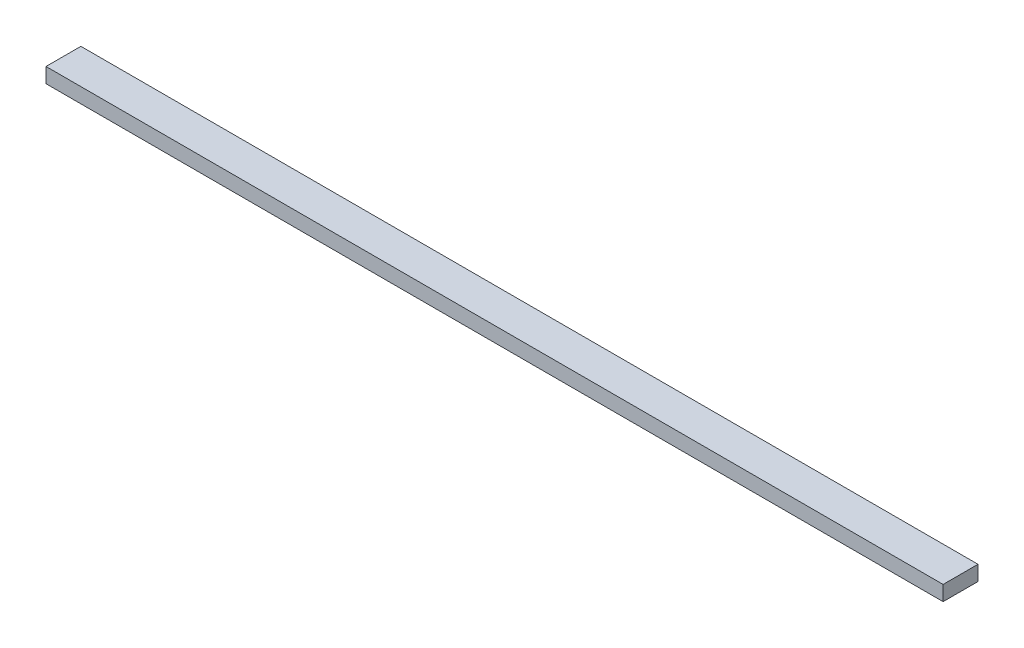
ISO-10303-21;
HEADER;
FILE_DESCRIPTION(('STEP AP214'),'2;1');
FILE_NAME('part.step','',(''),(''),'','','');
FILE_SCHEMA(('AUTOMOTIVE_DESIGN { 1 0 10303 214 1 1 1 1 }'));
ENDSEC;
DATA;
#1=APPLICATION_CONTEXT('core data for automotive mechanical design processes');
#2=APPLICATION_PROTOCOL_DEFINITION('international standard','automotive_design',2000,#1);
#3=PRODUCT_CONTEXT('',#1,'mechanical');
#4=PRODUCT('Part','Part','',(#3));
#5=PRODUCT_RELATED_PRODUCT_CATEGORY('part','',(#4));
#6=PRODUCT_DEFINITION_FORMATION('','',#4);
#7=PRODUCT_DEFINITION_CONTEXT('part definition',#1,'design');
#8=PRODUCT_DEFINITION('design','',#6,#7);
#9=PRODUCT_DEFINITION_SHAPE('','',#8);
#10=(LENGTH_UNIT() NAMED_UNIT(*) SI_UNIT(.MILLI.,.METRE.));
#11=(NAMED_UNIT(*) PLANE_ANGLE_UNIT() SI_UNIT($,.RADIAN.));
#12=(NAMED_UNIT(*) SI_UNIT($,.STERADIAN.) SOLID_ANGLE_UNIT());
#13=UNCERTAINTY_MEASURE_WITH_UNIT(LENGTH_MEASURE(1.E-05),#10,'distance_accuracy_value','');
#14=(GEOMETRIC_REPRESENTATION_CONTEXT(3) GLOBAL_UNCERTAINTY_ASSIGNED_CONTEXT((#13)) GLOBAL_UNIT_ASSIGNED_CONTEXT((#10,
#11,#12)) REPRESENTATION_CONTEXT('',''));
#15=CARTESIAN_POINT('',(0.,0.,0.));
#16=DIRECTION('',(0.,0.,1.));
#17=DIRECTION('',(1.,0.,0.));
#18=AXIS2_PLACEMENT_3D('',#15,#16,#17);
#19=CARTESIAN_POINT('',(2286.,19.05,-44.45));
#20=DIRECTION('',(0.,0.,1.));
#21=DIRECTION('',(0.,-1.,0.));
#22=AXIS2_PLACEMENT_3D('',#19,#20,#21);
#23=PLANE('',#22);
#24=DIRECTION('',(0.,1.,0.));
#25=VECTOR('',#24,1.);
#26=CARTESIAN_POINT('',(0.,19.05,-44.45));
#27=LINE('',#26,#25);
#28=CARTESIAN_POINT('',(0.,-19.05,-44.45));
#29=VERTEX_POINT('',#28);
#30=CARTESIAN_POINT('',(0.,19.05,-44.45));
#31=VERTEX_POINT('',#30);
#32=EDGE_CURVE('E96',#29,#31,#27,.T.);
#33=ORIENTED_EDGE('',*,*,#32,.T.);
#34=DIRECTION('',(-1.,0.,0.));
#35=VECTOR('',#34,1.);
#36=CARTESIAN_POINT('',(2286.,19.05,-44.45));
#37=LINE('',#36,#35);
#38=CARTESIAN_POINT('',(2286.,19.05,-44.45));
#39=VERTEX_POINT('',#38);
#40=EDGE_CURVE('E11',#39,#31,#37,.T.);
#41=ORIENTED_EDGE('',*,*,#40,.F.);
#42=DIRECTION('',(0.,1.,0.));
#43=VECTOR('',#42,1.);
#44=CARTESIAN_POINT('',(2286.,19.05,-44.45));
#45=LINE('',#44,#43);
#46=CARTESIAN_POINT('',(2286.,-19.05,-44.45));
#47=VERTEX_POINT('',#46);
#48=EDGE_CURVE('E84',#47,#39,#45,.T.);
#49=ORIENTED_EDGE('',*,*,#48,.F.);
#50=DIRECTION('',(-1.,0.,0.));
#51=VECTOR('',#50,1.);
#52=CARTESIAN_POINT('',(2286.,-19.05,-44.45));
#53=LINE('',#52,#51);
#54=EDGE_CURVE('E92',#47,#29,#53,.T.);
#55=ORIENTED_EDGE('',*,*,#54,.T.);
#56=EDGE_LOOP('',(#33,#41,#49,#55));
#57=FACE_BOUND('',#56,.T.);
#58=ADVANCED_FACE('F33',(#57),#23,.F.);
#59=CARTESIAN_POINT('',(2286.,19.05,44.45));
#60=DIRECTION('',(0.,-1.,0.));
#61=DIRECTION('',(0.,0.,-1.));
#62=AXIS2_PLACEMENT_3D('',#59,#60,#61);
#63=PLANE('',#62);
#64=DIRECTION('',(0.,0.,1.));
#65=VECTOR('',#64,1.);
#66=CARTESIAN_POINT('',(0.,19.05,44.45));
#67=LINE('',#66,#65);
#68=CARTESIAN_POINT('',(0.,19.05,44.45));
#69=VERTEX_POINT('',#68);
#70=EDGE_CURVE('E88',#31,#69,#67,.T.);
#71=ORIENTED_EDGE('',*,*,#70,.T.);
#72=DIRECTION('',(-1.,0.,0.));
#73=VECTOR('',#72,1.);
#74=CARTESIAN_POINT('',(2286.,19.05,44.45));
#75=LINE('',#74,#73);
#76=CARTESIAN_POINT('',(2286.,19.05,44.45));
#77=VERTEX_POINT('',#76);
#78=EDGE_CURVE('E41',#77,#69,#75,.T.);
#79=ORIENTED_EDGE('',*,*,#78,.F.);
#80=DIRECTION('',(0.,0.,1.));
#81=VECTOR('',#80,1.);
#82=CARTESIAN_POINT('',(2286.,19.05,44.45));
#83=LINE('',#82,#81);
#84=EDGE_CURVE('E79',#39,#77,#83,.T.);
#85=ORIENTED_EDGE('',*,*,#84,.F.);
#86=ORIENTED_EDGE('',*,*,#40,.T.);
#87=EDGE_LOOP('',(#71,#79,#85,#86));
#88=FACE_BOUND('',#87,.T.);
#89=ADVANCED_FACE('F87',(#88),#63,.F.);
#90=CARTESIAN_POINT('',(2286.,19.05,44.45));
#91=DIRECTION('',(0.,0.,-1.));
#92=DIRECTION('',(0.,1.,0.));
#93=AXIS2_PLACEMENT_3D('',#90,#91,#92);
#94=PLANE('',#93);
#95=DIRECTION('',(0.,-1.,0.));
#96=VECTOR('',#95,1.);
#97=CARTESIAN_POINT('',(0.,19.05,44.45));
#98=LINE('',#97,#96);
#99=CARTESIAN_POINT('',(0.,-19.05,44.45));
#100=VERTEX_POINT('',#99);
#101=EDGE_CURVE('E66',#69,#100,#98,.T.);
#102=ORIENTED_EDGE('',*,*,#101,.T.);
#103=DIRECTION('',(-1.,0.,0.));
#104=VECTOR('',#103,1.);
#105=CARTESIAN_POINT('',(2286.,-19.05,44.45));
#106=LINE('',#105,#104);
#107=CARTESIAN_POINT('',(2286.,-19.05,44.45));
#108=VERTEX_POINT('',#107);
#109=EDGE_CURVE('E89',#108,#100,#106,.T.);
#110=ORIENTED_EDGE('',*,*,#109,.F.);
#111=DIRECTION('',(0.,-1.,0.));
#112=VECTOR('',#111,1.);
#113=CARTESIAN_POINT('',(2286.,19.05,44.45));
#114=LINE('',#113,#112);
#115=EDGE_CURVE('E82',#77,#108,#114,.T.);
#116=ORIENTED_EDGE('',*,*,#115,.F.);
#117=ORIENTED_EDGE('',*,*,#78,.T.);
#118=EDGE_LOOP('',(#102,#110,#116,#117));
#119=FACE_BOUND('',#118,.T.);
#120=ADVANCED_FACE('F90',(#119),#94,.F.);
#121=CARTESIAN_POINT('',(2286.,-19.05,44.45));
#122=DIRECTION('',(0.,1.,0.));
#123=DIRECTION('',(0.,0.,1.));
#124=AXIS2_PLACEMENT_3D('',#121,#122,#123);
#125=PLANE('',#124);
#126=DIRECTION('',(0.,0.,-1.));
#127=VECTOR('',#126,1.);
#128=CARTESIAN_POINT('',(0.,-19.05,44.45));
#129=LINE('',#128,#127);
#130=EDGE_CURVE('E72',#100,#29,#129,.T.);
#131=ORIENTED_EDGE('',*,*,#130,.T.);
#132=ORIENTED_EDGE('',*,*,#54,.F.);
#133=DIRECTION('',(0.,0.,-1.));
#134=VECTOR('',#133,1.);
#135=CARTESIAN_POINT('',(2286.,-19.05,44.45));
#136=LINE('',#135,#134);
#137=EDGE_CURVE('E49',#108,#47,#136,.T.);
#138=ORIENTED_EDGE('',*,*,#137,.F.);
#139=ORIENTED_EDGE('',*,*,#109,.T.);
#140=EDGE_LOOP('',(#131,#132,#138,#139));
#141=FACE_BOUND('',#140,.T.);
#142=ADVANCED_FACE('F103',(#141),#125,.F.);
#143=CARTESIAN_POINT('',(2286.,0.,0.));
#144=DIRECTION('',(1.,0.,0.));
#145=DIRECTION('',(0.,0.,-1.));
#146=AXIS2_PLACEMENT_3D('',#143,#144,#145);
#147=PLANE('',#146);
#148=ORIENTED_EDGE('',*,*,#48,.T.);
#149=ORIENTED_EDGE('',*,*,#84,.T.);
#150=ORIENTED_EDGE('',*,*,#115,.T.);
#151=ORIENTED_EDGE('',*,*,#137,.T.);
#152=EDGE_LOOP('',(#148,#149,#150,#151));
#153=FACE_BOUND('',#152,.T.);
#154=ADVANCED_FACE('F80',(#153),#147,.T.);
#155=CARTESIAN_POINT('',(0.,0.,0.));
#156=DIRECTION('',(1.,0.,0.));
#157=DIRECTION('',(0.,0.,-1.));
#158=AXIS2_PLACEMENT_3D('',#155,#156,#157);
#159=PLANE('',#158);
#160=ORIENTED_EDGE('',*,*,#32,.F.);
#161=ORIENTED_EDGE('',*,*,#130,.F.);
#162=ORIENTED_EDGE('',*,*,#101,.F.);
#163=ORIENTED_EDGE('',*,*,#70,.F.);
#164=EDGE_LOOP('',(#160,#161,#162,#163));
#165=FACE_BOUND('',#164,.T.);
#166=ADVANCED_FACE('F106',(#165),#159,.F.);
#167=CLOSED_SHELL('',(#58,#89,#120,#142,#154,#166));
#168=MANIFOLD_SOLID_BREP('B2',#167);
#169=ADVANCED_BREP_SHAPE_REPRESENTATION('',(#18,#168),#14);
#170=SHAPE_DEFINITION_REPRESENTATION(#9,#169);
ENDSEC;
END-ISO-10303-21;
